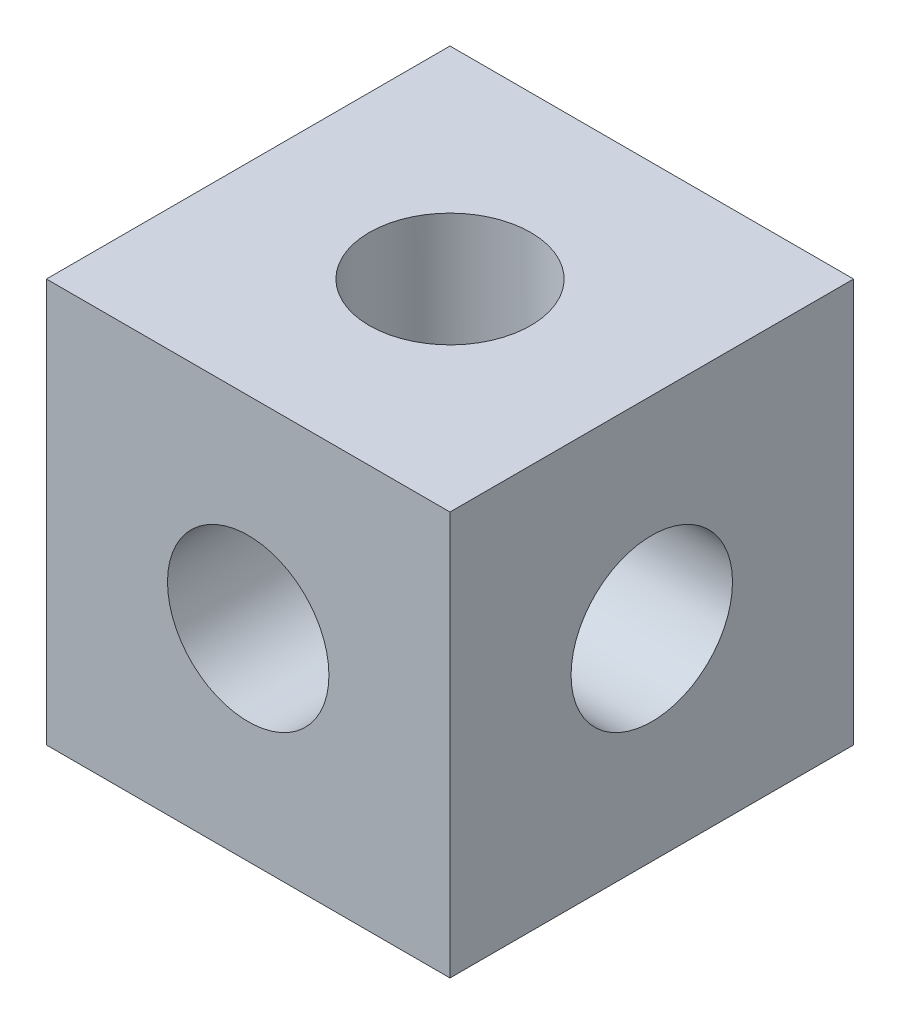
ISO-10303-21;
HEADER;
FILE_DESCRIPTION(('STEP AP214'),'2;1');
FILE_NAME('part.step','',(''),(''),'','','');
FILE_SCHEMA(('AUTOMOTIVE_DESIGN { 1 0 10303 214 1 1 1 1 }'));
ENDSEC;
DATA;
#1=APPLICATION_CONTEXT('core data for automotive mechanical design processes');
#2=APPLICATION_PROTOCOL_DEFINITION('international standard','automotive_design',2000,#1);
#3=PRODUCT_CONTEXT('',#1,'mechanical');
#4=PRODUCT('Part','Part','',(#3));
#5=PRODUCT_RELATED_PRODUCT_CATEGORY('part','',(#4));
#6=PRODUCT_DEFINITION_FORMATION('','',#4);
#7=PRODUCT_DEFINITION_CONTEXT('part definition',#1,'design');
#8=PRODUCT_DEFINITION('design','',#6,#7);
#9=PRODUCT_DEFINITION_SHAPE('','',#8);
#10=(LENGTH_UNIT() NAMED_UNIT(*) SI_UNIT(.MILLI.,.METRE.));
#11=(NAMED_UNIT(*) PLANE_ANGLE_UNIT() SI_UNIT($,.RADIAN.));
#12=(NAMED_UNIT(*) SI_UNIT($,.STERADIAN.) SOLID_ANGLE_UNIT());
#13=UNCERTAINTY_MEASURE_WITH_UNIT(LENGTH_MEASURE(1.E-05),#10,'distance_accuracy_value','');
#14=(GEOMETRIC_REPRESENTATION_CONTEXT(3) GLOBAL_UNCERTAINTY_ASSIGNED_CONTEXT((#13)) GLOBAL_UNIT_ASSIGNED_CONTEXT((#10,
#11,#12)) REPRESENTATION_CONTEXT('',''));
#15=CARTESIAN_POINT('',(0.,0.,0.));
#16=DIRECTION('',(0.,0.,1.));
#17=DIRECTION('',(1.,0.,0.));
#18=AXIS2_PLACEMENT_3D('',#15,#16,#17);
#19=CARTESIAN_POINT('',(0.,10.,0.));
#20=DIRECTION('',(0.,-1.,0.));
#21=DIRECTION('',(0.,0.,-1.));
#22=AXIS2_PLACEMENT_3D('',#19,#20,#21);
#23=CYLINDRICAL_SURFACE('',#22,2.);
#24=CARTESIAN_POINT('',(0.,5.,0.));
#25=DIRECTION('',(0.707106781186547,-0.707106781186547,0.));
#26=DIRECTION('',(-0.707106781186547,-0.707106781186547,0.));
#27=AXIS2_PLACEMENT_3D('',#24,#25,#26);
#28=ELLIPSE('',#27,2.82842712474619,2.);
#29=CARTESIAN_POINT('',(1.41421356237309,6.4142135623731,1.41421356237309));
#30=VERTEX_POINT('',#29);
#31=CARTESIAN_POINT('',(1.4142135623731,6.41421356237309,-1.4142135623731));
#32=VERTEX_POINT('',#31);
#33=EDGE_CURVE('E107',#30,#32,#28,.F.);
#34=ORIENTED_EDGE('',*,*,#33,.F.);
#35=CARTESIAN_POINT('',(0.,5.,0.));
#36=DIRECTION('',(0.,-0.707106781186547,0.707106781186547));
#37=DIRECTION('',(0.,-0.707106781186547,-0.707106781186547));
#38=AXIS2_PLACEMENT_3D('',#35,#36,#37);
#39=ELLIPSE('',#38,2.82842712474619,2.);
#40=CARTESIAN_POINT('',(-1.41421356237309,6.41421356237309,1.41421356237309));
#41=VERTEX_POINT('',#40);
#42=EDGE_CURVE('E114',#41,#30,#39,.F.);
#43=ORIENTED_EDGE('',*,*,#42,.F.);
#44=CARTESIAN_POINT('',(0.,5.,0.));
#45=DIRECTION('',(-0.707106781186547,-0.707106781186547,0.));
#46=DIRECTION('',(0.707106781186547,-0.707106781186547,0.));
#47=AXIS2_PLACEMENT_3D('',#44,#45,#46);
#48=ELLIPSE('',#47,2.82842712474619,2.);
#49=CARTESIAN_POINT('',(-1.41421356237309,6.41421356237309,-1.4142135623731));
#50=VERTEX_POINT('',#49);
#51=EDGE_CURVE('E67',#50,#41,#48,.F.);
#52=ORIENTED_EDGE('',*,*,#51,.F.);
#53=CARTESIAN_POINT('',(0.,5.,0.));
#54=DIRECTION('',(0.,-0.707106781186547,-0.707106781186547));
#55=DIRECTION('',(0.,-0.707106781186547,0.707106781186547));
#56=AXIS2_PLACEMENT_3D('',#53,#54,#55);
#57=ELLIPSE('',#56,2.82842712474619,2.);
#58=EDGE_CURVE('E120',#32,#50,#57,.F.);
#59=ORIENTED_EDGE('',*,*,#58,.F.);
#60=EDGE_LOOP('',(#34,#43,#52,#59));
#61=FACE_BOUND('',#60,.T.);
#62=CARTESIAN_POINT('',(0.,10.,0.));
#63=DIRECTION('',(0.,1.,0.));
#64=DIRECTION('',(0.,0.,1.));
#65=AXIS2_PLACEMENT_3D('',#62,#63,#64);
#66=CIRCLE('',#65,2.);
#67=CARTESIAN_POINT('',(0.,10.,2.));
#68=VERTEX_POINT('',#67);
#69=EDGE_CURVE('E169',#68,#68,#66,.T.);
#70=ORIENTED_EDGE('',*,*,#69,.T.);
#71=EDGE_LOOP('',(#70));
#72=FACE_BOUND('',#71,.T.);
#73=ADVANCED_FACE('F43',(#61,#72),#23,.F.);
#74=CARTESIAN_POINT('',(0.,10.,0.));
#75=DIRECTION('',(0.,-1.,0.));
#76=DIRECTION('',(0.,0.,-1.));
#77=AXIS2_PLACEMENT_3D('',#74,#75,#76);
#78=PLANE('',#77);
#79=DIRECTION('',(0.,0.,-1.));
#80=VECTOR('',#79,1.);
#81=CARTESIAN_POINT('',(5.,10.,5.));
#82=LINE('',#81,#80);
#83=CARTESIAN_POINT('',(5.,10.,5.));
#84=VERTEX_POINT('',#83);
#85=CARTESIAN_POINT('',(5.,10.,-5.));
#86=VERTEX_POINT('',#85);
#87=EDGE_CURVE('E158',#84,#86,#82,.T.);
#88=ORIENTED_EDGE('',*,*,#87,.T.);
#89=DIRECTION('',(-1.,0.,0.));
#90=VECTOR('',#89,1.);
#91=CARTESIAN_POINT('',(-5.,10.,-5.));
#92=LINE('',#91,#90);
#93=CARTESIAN_POINT('',(-5.,10.,-5.));
#94=VERTEX_POINT('',#93);
#95=EDGE_CURVE('E175',#86,#94,#92,.T.);
#96=ORIENTED_EDGE('',*,*,#95,.T.);
#97=DIRECTION('',(0.,0.,1.));
#98=VECTOR('',#97,1.);
#99=CARTESIAN_POINT('',(-5.,10.,5.));
#100=LINE('',#99,#98);
#101=CARTESIAN_POINT('',(-5.,10.,5.));
#102=VERTEX_POINT('',#101);
#103=EDGE_CURVE('E172',#94,#102,#100,.T.);
#104=ORIENTED_EDGE('',*,*,#103,.T.);
#105=DIRECTION('',(1.,0.,0.));
#106=VECTOR('',#105,1.);
#107=CARTESIAN_POINT('',(-5.,10.,5.));
#108=LINE('',#107,#106);
#109=EDGE_CURVE('E154',#102,#84,#108,.T.);
#110=ORIENTED_EDGE('',*,*,#109,.T.);
#111=EDGE_LOOP('',(#88,#96,#104,#110));
#112=FACE_BOUND('',#111,.T.);
#113=ORIENTED_EDGE('',*,*,#69,.F.);
#114=EDGE_LOOP('',(#113));
#115=FACE_BOUND('',#114,.T.);
#116=ADVANCED_FACE('F230',(#112,#115),#78,.F.);
#117=CARTESIAN_POINT('',(0.,0.,0.));
#118=DIRECTION('',(0.,-1.,0.));
#119=DIRECTION('',(0.,0.,-1.));
#120=AXIS2_PLACEMENT_3D('',#117,#118,#119);
#121=PLANE('',#120);
#122=DIRECTION('',(0.,0.,-1.));
#123=VECTOR('',#122,1.);
#124=CARTESIAN_POINT('',(5.,0.,5.));
#125=LINE('',#124,#123);
#126=CARTESIAN_POINT('',(5.,0.,5.));
#127=VERTEX_POINT('',#126);
#128=CARTESIAN_POINT('',(5.,0.,-5.));
#129=VERTEX_POINT('',#128);
#130=EDGE_CURVE('E165',#127,#129,#125,.T.);
#131=ORIENTED_EDGE('',*,*,#130,.F.);
#132=DIRECTION('',(1.,0.,0.));
#133=VECTOR('',#132,1.);
#134=CARTESIAN_POINT('',(-5.,0.,5.));
#135=LINE('',#134,#133);
#136=CARTESIAN_POINT('',(-5.,0.,5.));
#137=VERTEX_POINT('',#136);
#138=EDGE_CURVE('E155',#137,#127,#135,.T.);
#139=ORIENTED_EDGE('',*,*,#138,.F.);
#140=DIRECTION('',(0.,0.,1.));
#141=VECTOR('',#140,1.);
#142=CARTESIAN_POINT('',(-5.,0.,5.));
#143=LINE('',#142,#141);
#144=CARTESIAN_POINT('',(-5.,0.,-5.));
#145=VERTEX_POINT('',#144);
#146=EDGE_CURVE('E159',#145,#137,#143,.T.);
#147=ORIENTED_EDGE('',*,*,#146,.F.);
#148=DIRECTION('',(-1.,0.,0.));
#149=VECTOR('',#148,1.);
#150=CARTESIAN_POINT('',(-5.,0.,-5.));
#151=LINE('',#150,#149);
#152=EDGE_CURVE('E162',#129,#145,#151,.T.);
#153=ORIENTED_EDGE('',*,*,#152,.F.);
#154=EDGE_LOOP('',(#131,#139,#147,#153));
#155=FACE_BOUND('',#154,.T.);
#156=CARTESIAN_POINT('',(0.,0.,0.));
#157=DIRECTION('',(0.,1.,0.));
#158=DIRECTION('',(0.,0.,1.));
#159=AXIS2_PLACEMENT_3D('',#156,#157,#158);
#160=CIRCLE('',#159,2.);
#161=CARTESIAN_POINT('',(0.,0.,2.));
#162=VERTEX_POINT('',#161);
#163=EDGE_CURVE('E181',#162,#162,#160,.T.);
#164=ORIENTED_EDGE('',*,*,#163,.T.);
#165=EDGE_LOOP('',(#164));
#166=FACE_BOUND('',#165,.T.);
#167=ADVANCED_FACE('F236',(#155,#166),#121,.T.);
#168=CARTESIAN_POINT('',(5.,10.,5.));
#169=DIRECTION('',(-1.,0.,0.));
#170=DIRECTION('',(0.,0.,1.));
#171=AXIS2_PLACEMENT_3D('',#168,#169,#170);
#172=PLANE('',#171);
#173=CARTESIAN_POINT('',(5.,5.,0.));
#174=DIRECTION('',(1.,0.,0.));
#175=DIRECTION('',(0.,0.,-1.));
#176=AXIS2_PLACEMENT_3D('',#173,#174,#175);
#177=CIRCLE('',#176,2.);
#178=CARTESIAN_POINT('',(5.,5.,-2.));
#179=VERTEX_POINT('',#178);
#180=EDGE_CURVE('E210',#179,#179,#177,.T.);
#181=ORIENTED_EDGE('',*,*,#180,.F.);
#182=EDGE_LOOP('',(#181));
#183=FACE_BOUND('',#182,.T.);
#184=ORIENTED_EDGE('',*,*,#130,.T.);
#185=DIRECTION('',(0.,-1.,0.));
#186=VECTOR('',#185,1.);
#187=CARTESIAN_POINT('',(5.,10.,-5.));
#188=LINE('',#187,#186);
#189=EDGE_CURVE('E138',#86,#129,#188,.T.);
#190=ORIENTED_EDGE('',*,*,#189,.F.);
#191=ORIENTED_EDGE('',*,*,#87,.F.);
#192=DIRECTION('',(0.,-1.,0.));
#193=VECTOR('',#192,1.);
#194=CARTESIAN_POINT('',(5.,10.,5.));
#195=LINE('',#194,#193);
#196=EDGE_CURVE('E150',#84,#127,#195,.T.);
#197=ORIENTED_EDGE('',*,*,#196,.T.);
#198=EDGE_LOOP('',(#184,#190,#191,#197));
#199=FACE_BOUND('',#198,.T.);
#200=ADVANCED_FACE('F45',(#183,#199),#172,.F.);
#201=CARTESIAN_POINT('',(-5.,10.,-5.));
#202=DIRECTION('',(0.,0.,1.));
#203=DIRECTION('',(1.,0.,0.));
#204=AXIS2_PLACEMENT_3D('',#201,#202,#203);
#205=PLANE('',#204);
#206=CARTESIAN_POINT('',(0.,5.,-5.));
#207=DIRECTION('',(0.,0.,1.));
#208=DIRECTION('',(1.,0.,0.));
#209=AXIS2_PLACEMENT_3D('',#206,#207,#208);
#210=CIRCLE('',#209,2.);
#211=CARTESIAN_POINT('',(2.,5.,-5.));
#212=VERTEX_POINT('',#211);
#213=EDGE_CURVE('E185',#212,#212,#210,.T.);
#214=ORIENTED_EDGE('',*,*,#213,.T.);
#215=EDGE_LOOP('',(#214));
#216=FACE_BOUND('',#215,.T.);
#217=ORIENTED_EDGE('',*,*,#152,.T.);
#218=DIRECTION('',(0.,-1.,0.));
#219=VECTOR('',#218,1.);
#220=CARTESIAN_POINT('',(-5.,10.,-5.));
#221=LINE('',#220,#219);
#222=EDGE_CURVE('E142',#94,#145,#221,.T.);
#223=ORIENTED_EDGE('',*,*,#222,.F.);
#224=ORIENTED_EDGE('',*,*,#95,.F.);
#225=ORIENTED_EDGE('',*,*,#189,.T.);
#226=EDGE_LOOP('',(#217,#223,#224,#225));
#227=FACE_BOUND('',#226,.T.);
#228=ADVANCED_FACE('F261',(#216,#227),#205,.F.);
#229=CARTESIAN_POINT('',(-5.,10.,5.));
#230=DIRECTION('',(1.,0.,0.));
#231=DIRECTION('',(0.,0.,-1.));
#232=AXIS2_PLACEMENT_3D('',#229,#230,#231);
#233=PLANE('',#232);
#234=CARTESIAN_POINT('',(-5.,5.,0.));
#235=DIRECTION('',(1.,0.,0.));
#236=DIRECTION('',(0.,0.,-1.));
#237=AXIS2_PLACEMENT_3D('',#234,#235,#236);
#238=CIRCLE('',#237,2.);
#239=CARTESIAN_POINT('',(-5.,5.,-2.));
#240=VERTEX_POINT('',#239);
#241=EDGE_CURVE('E209',#240,#240,#238,.T.);
#242=ORIENTED_EDGE('',*,*,#241,.T.);
#243=EDGE_LOOP('',(#242));
#244=FACE_BOUND('',#243,.T.);
#245=ORIENTED_EDGE('',*,*,#146,.T.);
#246=DIRECTION('',(0.,-1.,0.));
#247=VECTOR('',#246,1.);
#248=CARTESIAN_POINT('',(-5.,10.,5.));
#249=LINE('',#248,#247);
#250=EDGE_CURVE('E146',#102,#137,#249,.T.);
#251=ORIENTED_EDGE('',*,*,#250,.F.);
#252=ORIENTED_EDGE('',*,*,#103,.F.);
#253=ORIENTED_EDGE('',*,*,#222,.T.);
#254=EDGE_LOOP('',(#245,#251,#252,#253));
#255=FACE_BOUND('',#254,.T.);
#256=ADVANCED_FACE('F218',(#244,#255),#233,.F.);
#257=CARTESIAN_POINT('',(-5.,10.,5.));
#258=DIRECTION('',(0.,0.,-1.));
#259=DIRECTION('',(-1.,0.,0.));
#260=AXIS2_PLACEMENT_3D('',#257,#258,#259);
#261=PLANE('',#260);
#262=CARTESIAN_POINT('',(0.,5.,5.));
#263=DIRECTION('',(0.,0.,1.));
#264=DIRECTION('',(1.,0.,0.));
#265=AXIS2_PLACEMENT_3D('',#262,#263,#264);
#266=CIRCLE('',#265,2.);
#267=CARTESIAN_POINT('',(2.,5.,5.));
#268=VERTEX_POINT('',#267);
#269=EDGE_CURVE('E189',#268,#268,#266,.T.);
#270=ORIENTED_EDGE('',*,*,#269,.F.);
#271=EDGE_LOOP('',(#270));
#272=FACE_BOUND('',#271,.T.);
#273=ORIENTED_EDGE('',*,*,#138,.T.);
#274=ORIENTED_EDGE('',*,*,#196,.F.);
#275=ORIENTED_EDGE('',*,*,#109,.F.);
#276=ORIENTED_EDGE('',*,*,#250,.T.);
#277=EDGE_LOOP('',(#273,#274,#275,#276));
#278=FACE_BOUND('',#277,.T.);
#279=ADVANCED_FACE('F241',(#272,#278),#261,.F.);
#280=CARTESIAN_POINT('',(0.,5.,0.));
#281=DIRECTION('',(0.707106781186547,-0.707106781186547,0.));
#282=DIRECTION('',(-0.707106781186547,-0.707106781186547,0.));
#283=AXIS2_PLACEMENT_3D('',#280,#281,#282);
#284=ELLIPSE('',#283,2.82842712474619,2.);
#285=CARTESIAN_POINT('',(-1.41421356237309,3.58578643762691,1.41421356237309));
#286=VERTEX_POINT('',#285);
#287=CARTESIAN_POINT('',(-1.41421356237309,3.58578643762691,-1.4142135623731));
#288=VERTEX_POINT('',#287);
#289=EDGE_CURVE('E202',#286,#288,#284,.T.);
#290=ORIENTED_EDGE('',*,*,#289,.F.);
#291=CARTESIAN_POINT('',(0.,5.,0.));
#292=DIRECTION('',(0.,-0.707106781186547,-0.707106781186547));
#293=DIRECTION('',(0.,-0.707106781186547,0.707106781186547));
#294=AXIS2_PLACEMENT_3D('',#291,#292,#293);
#295=ELLIPSE('',#294,2.82842712474619,2.);
#296=CARTESIAN_POINT('',(1.41421356237309,3.58578643762691,1.41421356237309));
#297=VERTEX_POINT('',#296);
#298=EDGE_CURVE('E131',#297,#286,#295,.T.);
#299=ORIENTED_EDGE('',*,*,#298,.F.);
#300=CARTESIAN_POINT('',(0.,5.,0.));
#301=DIRECTION('',(-0.707106781186547,-0.707106781186547,0.));
#302=DIRECTION('',(0.707106781186547,-0.707106781186547,0.));
#303=AXIS2_PLACEMENT_3D('',#300,#301,#302);
#304=ELLIPSE('',#303,2.82842712474619,2.);
#305=CARTESIAN_POINT('',(1.4142135623731,3.58578643762691,-1.4142135623731));
#306=VERTEX_POINT('',#305);
#307=EDGE_CURVE('E59',#306,#297,#304,.T.);
#308=ORIENTED_EDGE('',*,*,#307,.F.);
#309=CARTESIAN_POINT('',(0.,5.,0.));
#310=DIRECTION('',(0.,-0.707106781186547,0.707106781186547));
#311=DIRECTION('',(0.,-0.707106781186547,-0.707106781186547));
#312=AXIS2_PLACEMENT_3D('',#309,#310,#311);
#313=ELLIPSE('',#312,2.82842712474619,2.);
#314=EDGE_CURVE('E127',#288,#306,#313,.T.);
#315=ORIENTED_EDGE('',*,*,#314,.F.);
#316=EDGE_LOOP('',(#290,#299,#308,#315));
#317=FACE_BOUND('',#316,.T.);
#318=ORIENTED_EDGE('',*,*,#163,.F.);
#319=EDGE_LOOP('',(#318));
#320=FACE_BOUND('',#319,.T.);
#321=ADVANCED_FACE('F232',(#317,#320),#23,.F.);
#322=CARTESIAN_POINT('',(0.,5.,-5.));
#323=DIRECTION('',(0.,0.,1.));
#324=DIRECTION('',(1.,0.,0.));
#325=AXIS2_PLACEMENT_3D('',#322,#323,#324);
#326=CYLINDRICAL_SURFACE('',#325,2.);
#327=ORIENTED_EDGE('',*,*,#314,.T.);
#328=CARTESIAN_POINT('',(0.,5.,0.));
#329=DIRECTION('',(0.707106781186547,0.,0.707106781186547));
#330=DIRECTION('',(-0.707106781186547,0.,0.707106781186547));
#331=AXIS2_PLACEMENT_3D('',#328,#329,#330);
#332=ELLIPSE('',#331,2.82842712474619,2.);
#333=EDGE_CURVE('E122',#306,#32,#332,.T.);
#334=ORIENTED_EDGE('',*,*,#333,.T.);
#335=ORIENTED_EDGE('',*,*,#58,.T.);
#336=CARTESIAN_POINT('',(0.,5.,0.));
#337=DIRECTION('',(-0.707106781186547,0.,0.707106781186547));
#338=DIRECTION('',(0.707106781186547,0.,0.707106781186547));
#339=AXIS2_PLACEMENT_3D('',#336,#337,#338);
#340=ELLIPSE('',#339,2.82842712474619,2.);
#341=EDGE_CURVE('E193',#50,#288,#340,.T.);
#342=ORIENTED_EDGE('',*,*,#341,.T.);
#343=EDGE_LOOP('',(#327,#334,#335,#342));
#344=FACE_BOUND('',#343,.T.);
#345=ORIENTED_EDGE('',*,*,#213,.F.);
#346=EDGE_LOOP('',(#345));
#347=FACE_BOUND('',#346,.T.);
#348=ADVANCED_FACE('F240',(#344,#347),#326,.F.);
#349=ORIENTED_EDGE('',*,*,#298,.T.);
#350=CARTESIAN_POINT('',(0.,5.,0.));
#351=DIRECTION('',(0.707106781186547,0.,0.707106781186547));
#352=DIRECTION('',(-0.707106781186547,0.,0.707106781186547));
#353=AXIS2_PLACEMENT_3D('',#350,#351,#352);
#354=ELLIPSE('',#353,2.82842712474619,2.);
#355=EDGE_CURVE('E11',#286,#41,#354,.F.);
#356=ORIENTED_EDGE('',*,*,#355,.T.);
#357=ORIENTED_EDGE('',*,*,#42,.T.);
#358=CARTESIAN_POINT('',(0.,5.,0.));
#359=DIRECTION('',(-0.707106781186547,0.,0.707106781186547));
#360=DIRECTION('',(0.707106781186547,0.,0.707106781186547));
#361=AXIS2_PLACEMENT_3D('',#358,#359,#360);
#362=ELLIPSE('',#361,2.82842712474619,2.);
#363=EDGE_CURVE('E52',#30,#297,#362,.F.);
#364=ORIENTED_EDGE('',*,*,#363,.T.);
#365=EDGE_LOOP('',(#349,#356,#357,#364));
#366=FACE_BOUND('',#365,.T.);
#367=ORIENTED_EDGE('',*,*,#269,.T.);
#368=EDGE_LOOP('',(#367));
#369=FACE_BOUND('',#368,.T.);
#370=ADVANCED_FACE('F124',(#366,#369),#326,.F.);
#371=CARTESIAN_POINT('',(-5.,5.,0.));
#372=DIRECTION('',(1.,0.,0.));
#373=DIRECTION('',(0.,0.,-1.));
#374=AXIS2_PLACEMENT_3D('',#371,#372,#373);
#375=CYLINDRICAL_SURFACE('',#374,2.);
#376=ORIENTED_EDGE('',*,*,#180,.T.);
#377=EDGE_LOOP('',(#376));
#378=FACE_BOUND('',#377,.T.);
#379=ORIENTED_EDGE('',*,*,#307,.T.);
#380=ORIENTED_EDGE('',*,*,#363,.F.);
#381=ORIENTED_EDGE('',*,*,#33,.T.);
#382=ORIENTED_EDGE('',*,*,#333,.F.);
#383=EDGE_LOOP('',(#379,#380,#381,#382));
#384=FACE_BOUND('',#383,.T.);
#385=ADVANCED_FACE('F106',(#378,#384),#375,.F.);
#386=ORIENTED_EDGE('',*,*,#241,.F.);
#387=EDGE_LOOP('',(#386));
#388=FACE_BOUND('',#387,.T.);
#389=ORIENTED_EDGE('',*,*,#51,.T.);
#390=ORIENTED_EDGE('',*,*,#355,.F.);
#391=ORIENTED_EDGE('',*,*,#289,.T.);
#392=ORIENTED_EDGE('',*,*,#341,.F.);
#393=EDGE_LOOP('',(#389,#390,#391,#392));
#394=FACE_BOUND('',#393,.T.);
#395=ADVANCED_FACE('F221',(#388,#394),#375,.F.);
#396=CLOSED_SHELL('',(#73,#116,#167,#200,#228,#256,#279,#321,#348,#370,#385,#395));
#397=MANIFOLD_SOLID_BREP('B2',#396);
#398=ADVANCED_BREP_SHAPE_REPRESENTATION('',(#18,#397),#14);
#399=SHAPE_DEFINITION_REPRESENTATION(#9,#398);
ENDSEC;
END-ISO-10303-21;
